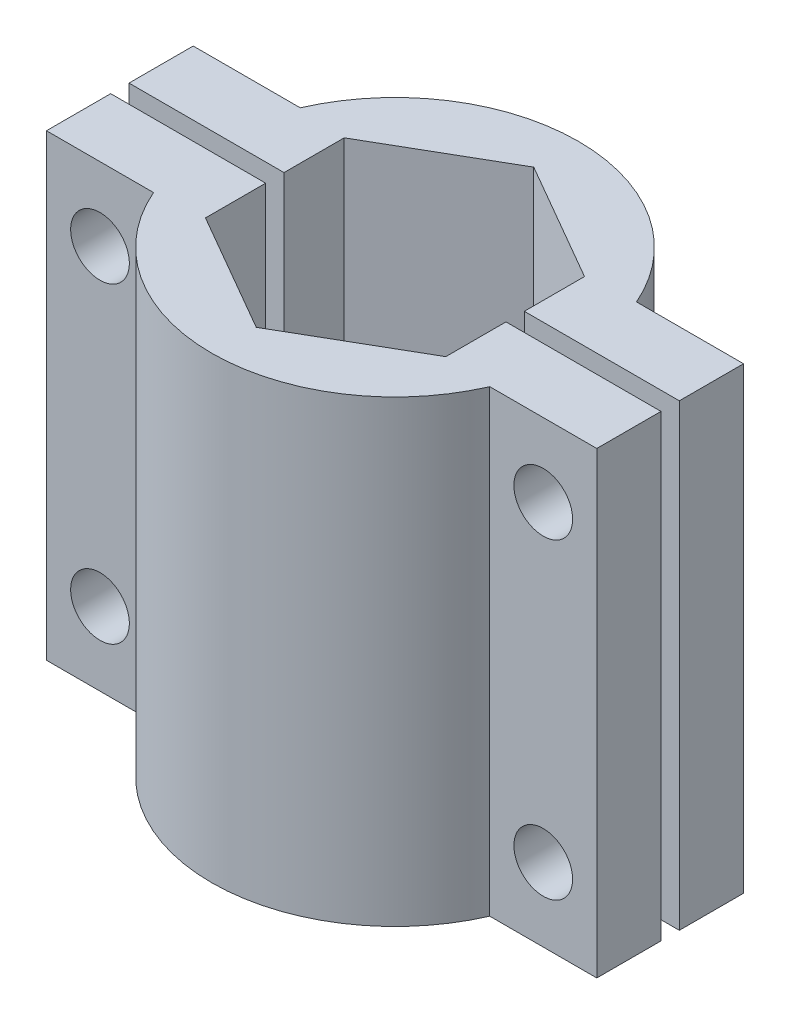
ISO-10303-21;
HEADER;
FILE_DESCRIPTION(('STEP AP214'),'2;1');
FILE_NAME('part.step','',(''),(''),'','','');
FILE_SCHEMA(('AUTOMOTIVE_DESIGN { 1 0 10303 214 1 1 1 1 }'));
ENDSEC;
DATA;
#1=APPLICATION_CONTEXT('core data for automotive mechanical design processes');
#2=APPLICATION_PROTOCOL_DEFINITION('international standard','automotive_design',2000,#1);
#3=PRODUCT_CONTEXT('',#1,'mechanical');
#4=PRODUCT('Part','Part','',(#3));
#5=PRODUCT_RELATED_PRODUCT_CATEGORY('part','',(#4));
#6=PRODUCT_DEFINITION_FORMATION('','',#4);
#7=PRODUCT_DEFINITION_CONTEXT('part definition',#1,'design');
#8=PRODUCT_DEFINITION('design','',#6,#7);
#9=PRODUCT_DEFINITION_SHAPE('','',#8);
#10=(LENGTH_UNIT() NAMED_UNIT(*) SI_UNIT(.MILLI.,.METRE.));
#11=(NAMED_UNIT(*) PLANE_ANGLE_UNIT() SI_UNIT($,.RADIAN.));
#12=(NAMED_UNIT(*) SI_UNIT($,.STERADIAN.) SOLID_ANGLE_UNIT());
#13=UNCERTAINTY_MEASURE_WITH_UNIT(LENGTH_MEASURE(1.E-05),#10,'distance_accuracy_value','');
#14=(GEOMETRIC_REPRESENTATION_CONTEXT(3) GLOBAL_UNCERTAINTY_ASSIGNED_CONTEXT((#13)) GLOBAL_UNIT_ASSIGNED_CONTEXT((#10,
#11,#12)) REPRESENTATION_CONTEXT('',''));
#15=CARTESIAN_POINT('',(0.,0.,0.));
#16=DIRECTION('',(0.,0.,1.));
#17=DIRECTION('',(1.,0.,0.));
#18=AXIS2_PLACEMENT_3D('',#15,#16,#17);
#19=CARTESIAN_POINT('',(15.,25.,4.));
#20=DIRECTION('',(-1.,0.,0.));
#21=DIRECTION('',(0.,0.,1.));
#22=AXIS2_PLACEMENT_3D('',#19,#20,#21);
#23=PLANE('',#22);
#24=DIRECTION('',(0.,-1.,0.));
#25=VECTOR('',#24,1.);
#26=CARTESIAN_POINT('',(15.,25.,-0.5));
#27=LINE('',#26,#25);
#28=CARTESIAN_POINT('',(15.,25.,-0.5));
#29=VERTEX_POINT('',#28);
#30=CARTESIAN_POINT('',(15.,0.,-0.5));
#31=VERTEX_POINT('',#30);
#32=EDGE_CURVE('E119',#29,#31,#27,.T.);
#33=ORIENTED_EDGE('',*,*,#32,.T.);
#34=DIRECTION('',(0.,0.,-1.));
#35=VECTOR('',#34,1.);
#36=CARTESIAN_POINT('',(15.,0.,4.));
#37=LINE('',#36,#35);
#38=CARTESIAN_POINT('',(15.,0.,-4.));
#39=VERTEX_POINT('',#38);
#40=EDGE_CURVE('E116',#31,#39,#37,.T.);
#41=ORIENTED_EDGE('',*,*,#40,.T.);
#42=DIRECTION('',(0.,-1.,0.));
#43=VECTOR('',#42,1.);
#44=CARTESIAN_POINT('',(15.,25.,-4.));
#45=LINE('',#44,#43);
#46=CARTESIAN_POINT('',(15.,25.,-4.));
#47=VERTEX_POINT('',#46);
#48=EDGE_CURVE('E170',#47,#39,#45,.T.);
#49=ORIENTED_EDGE('',*,*,#48,.F.);
#50=DIRECTION('',(0.,0.,-1.));
#51=VECTOR('',#50,1.);
#52=CARTESIAN_POINT('',(15.,25.,4.));
#53=LINE('',#52,#51);
#54=EDGE_CURVE('E107',#29,#47,#53,.T.);
#55=ORIENTED_EDGE('',*,*,#54,.F.);
#56=EDGE_LOOP('',(#33,#41,#49,#55));
#57=FACE_BOUND('',#56,.T.);
#58=ADVANCED_FACE('F44',(#57),#23,.F.);
#59=CARTESIAN_POINT('',(-15.,25.,4.));
#60=DIRECTION('',(1.,0.,0.));
#61=DIRECTION('',(0.,0.,-1.));
#62=AXIS2_PLACEMENT_3D('',#59,#60,#61);
#63=PLANE('',#62);
#64=DIRECTION('',(0.,-1.,0.));
#65=VECTOR('',#64,1.);
#66=CARTESIAN_POINT('',(-15.,25.,-0.5));
#67=LINE('',#66,#65);
#68=CARTESIAN_POINT('',(-15.,25.,-0.5));
#69=VERTEX_POINT('',#68);
#70=CARTESIAN_POINT('',(-15.,0.,-0.5));
#71=VERTEX_POINT('',#70);
#72=EDGE_CURVE('E12',#69,#71,#67,.T.);
#73=ORIENTED_EDGE('',*,*,#72,.F.);
#74=DIRECTION('',(0.,0.,1.));
#75=VECTOR('',#74,1.);
#76=CARTESIAN_POINT('',(-15.,25.,4.));
#77=LINE('',#76,#75);
#78=CARTESIAN_POINT('',(-15.,25.,-4.));
#79=VERTEX_POINT('',#78);
#80=EDGE_CURVE('E98',#79,#69,#77,.T.);
#81=ORIENTED_EDGE('',*,*,#80,.F.);
#82=DIRECTION('',(0.,-1.,0.));
#83=VECTOR('',#82,1.);
#84=CARTESIAN_POINT('',(-15.,25.,-4.));
#85=LINE('',#84,#83);
#86=CARTESIAN_POINT('',(-15.,0.,-4.));
#87=VERTEX_POINT('',#86);
#88=EDGE_CURVE('E112',#79,#87,#85,.T.);
#89=ORIENTED_EDGE('',*,*,#88,.T.);
#90=DIRECTION('',(0.,0.,1.));
#91=VECTOR('',#90,1.);
#92=CARTESIAN_POINT('',(-15.,0.,4.));
#93=LINE('',#92,#91);
#94=EDGE_CURVE('E100',#87,#71,#93,.T.);
#95=ORIENTED_EDGE('',*,*,#94,.T.);
#96=EDGE_LOOP('',(#73,#81,#89,#95));
#97=FACE_BOUND('',#96,.T.);
#98=ADVANCED_FACE('F95',(#97),#63,.F.);
#99=CARTESIAN_POINT('',(0.,25.,0.));
#100=DIRECTION('',(0.,1.,0.));
#101=DIRECTION('',(0.,0.,1.));
#102=AXIS2_PLACEMENT_3D('',#99,#100,#101);
#103=PLANE('',#102);
#104=ORIENTED_EDGE('',*,*,#80,.T.);
#105=DIRECTION('',(-1.,0.,0.));
#106=VECTOR('',#105,1.);
#107=CARTESIAN_POINT('',(-15.,25.,-0.5));
#108=LINE('',#107,#106);
#109=CARTESIAN_POINT('',(-6.55,25.,-0.5));
#110=VERTEX_POINT('',#109);
#111=EDGE_CURVE('E53',#110,#69,#108,.T.);
#112=ORIENTED_EDGE('',*,*,#111,.F.);
#113=DIRECTION('',(0.,0.,1.));
#114=VECTOR('',#113,1.);
#115=CARTESIAN_POINT('',(-6.55,25.,-3.78164426319205));
#116=LINE('',#115,#114);
#117=CARTESIAN_POINT('',(-6.55,25.,-3.78164426319205));
#118=VERTEX_POINT('',#117);
#119=EDGE_CURVE('E136',#118,#110,#116,.T.);
#120=ORIENTED_EDGE('',*,*,#119,.F.);
#121=DIRECTION('',(-0.866025403784439,0.,0.5));
#122=VECTOR('',#121,1.);
#123=CARTESIAN_POINT('',(0.,25.,-7.5632885263841));
#124=LINE('',#123,#122);
#125=CARTESIAN_POINT('',(0.,25.,-7.5632885263841));
#126=VERTEX_POINT('',#125);
#127=EDGE_CURVE('E181',#126,#118,#124,.T.);
#128=ORIENTED_EDGE('',*,*,#127,.F.);
#129=DIRECTION('',(-0.866025403784439,0.,-0.5));
#130=VECTOR('',#129,1.);
#131=CARTESIAN_POINT('',(6.55,25.,-3.78164426319205));
#132=LINE('',#131,#130);
#133=CARTESIAN_POINT('',(6.55,25.,-3.78164426319205));
#134=VERTEX_POINT('',#133);
#135=EDGE_CURVE('E198',#134,#126,#132,.T.);
#136=ORIENTED_EDGE('',*,*,#135,.F.);
#137=DIRECTION('',(0.,0.,-1.));
#138=VECTOR('',#137,1.);
#139=CARTESIAN_POINT('',(6.55,25.,3.78164426319205));
#140=LINE('',#139,#138);
#141=CARTESIAN_POINT('',(6.55,25.,-0.499999999999999));
#142=VERTEX_POINT('',#141);
#143=EDGE_CURVE('E138',#142,#134,#140,.T.);
#144=ORIENTED_EDGE('',*,*,#143,.F.);
#145=EDGE_CURVE('E91',#29,#142,#108,.T.);
#146=ORIENTED_EDGE('',*,*,#145,.F.);
#147=ORIENTED_EDGE('',*,*,#54,.T.);
#148=DIRECTION('',(-1.,0.,0.));
#149=VECTOR('',#148,1.);
#150=CARTESIAN_POINT('',(9.16515138991168,25.,-4.));
#151=LINE('',#150,#149);
#152=CARTESIAN_POINT('',(9.16515138991168,25.,-4.));
#153=VERTEX_POINT('',#152);
#154=EDGE_CURVE('E110',#47,#153,#151,.T.);
#155=ORIENTED_EDGE('',*,*,#154,.T.);
#156=CARTESIAN_POINT('',(0.,25.,0.));
#157=DIRECTION('',(0.,1.,0.));
#158=DIRECTION('',(0.,0.,1.));
#159=AXIS2_PLACEMENT_3D('',#156,#157,#158);
#160=CIRCLE('',#159,10.);
#161=CARTESIAN_POINT('',(-9.16515138991168,25.,-4.));
#162=VERTEX_POINT('',#161);
#163=EDGE_CURVE('E190',#153,#162,#160,.T.);
#164=ORIENTED_EDGE('',*,*,#163,.T.);
#165=DIRECTION('',(-1.,0.,0.));
#166=VECTOR('',#165,1.);
#167=CARTESIAN_POINT('',(-15.,25.,-4.));
#168=LINE('',#167,#166);
#169=EDGE_CURVE('E105',#162,#79,#168,.T.);
#170=ORIENTED_EDGE('',*,*,#169,.T.);
#171=EDGE_LOOP('',(#104,#112,#120,#128,#136,#144,#146,#147,#155,#164,#170));
#172=FACE_BOUND('',#171,.T.);
#173=ADVANCED_FACE('F102',(#172),#103,.T.);
#174=CARTESIAN_POINT('',(0.,0.,0.));
#175=DIRECTION('',(0.,1.,0.));
#176=DIRECTION('',(0.,0.,1.));
#177=AXIS2_PLACEMENT_3D('',#174,#175,#176);
#178=PLANE('',#177);
#179=DIRECTION('',(-1.,0.,0.));
#180=VECTOR('',#179,1.);
#181=CARTESIAN_POINT('',(-15.,0.,-0.5));
#182=LINE('',#181,#180);
#183=CARTESIAN_POINT('',(-3.00873727666608,0.,-0.5));
#184=VERTEX_POINT('',#183);
#185=EDGE_CURVE('E61',#184,#71,#182,.T.);
#186=ORIENTED_EDGE('',*,*,#185,.T.);
#187=ORIENTED_EDGE('',*,*,#94,.F.);
#188=DIRECTION('',(-1.,0.,0.));
#189=VECTOR('',#188,1.);
#190=CARTESIAN_POINT('',(-15.,0.,-4.));
#191=LINE('',#190,#189);
#192=CARTESIAN_POINT('',(-9.16515138991168,0.,-4.));
#193=VERTEX_POINT('',#192);
#194=EDGE_CURVE('E177',#193,#87,#191,.T.);
#195=ORIENTED_EDGE('',*,*,#194,.F.);
#196=CARTESIAN_POINT('',(0.,0.,0.));
#197=DIRECTION('',(0.,1.,0.));
#198=DIRECTION('',(0.,0.,1.));
#199=AXIS2_PLACEMENT_3D('',#196,#197,#198);
#200=CIRCLE('',#199,10.);
#201=CARTESIAN_POINT('',(9.16515138991168,0.,-4.));
#202=VERTEX_POINT('',#201);
#203=EDGE_CURVE('E173',#202,#193,#200,.T.);
#204=ORIENTED_EDGE('',*,*,#203,.F.);
#205=DIRECTION('',(-1.,0.,0.));
#206=VECTOR('',#205,1.);
#207=CARTESIAN_POINT('',(9.16515138991168,0.,-4.));
#208=LINE('',#207,#206);
#209=EDGE_CURVE('E142',#39,#202,#208,.T.);
#210=ORIENTED_EDGE('',*,*,#209,.F.);
#211=ORIENTED_EDGE('',*,*,#40,.F.);
#212=CARTESIAN_POINT('',(3.00873727666608,0.,-0.5));
#213=VERTEX_POINT('',#212);
#214=EDGE_CURVE('E129',#31,#213,#182,.T.);
#215=ORIENTED_EDGE('',*,*,#214,.T.);
#216=CARTESIAN_POINT('',(0.,0.,0.));
#217=DIRECTION('',(0.,-1.,0.));
#218=DIRECTION('',(0.,0.,-1.));
#219=AXIS2_PLACEMENT_3D('',#216,#217,#218);
#220=CIRCLE('',#219,3.05);
#221=EDGE_CURVE('E125',#184,#213,#220,.T.);
#222=ORIENTED_EDGE('',*,*,#221,.F.);
#223=EDGE_LOOP('',(#186,#187,#195,#204,#210,#211,#215,#222));
#224=FACE_BOUND('',#223,.T.);
#225=ADVANCED_FACE('F223',(#224),#178,.F.);
#226=CARTESIAN_POINT('',(0.,12.5,0.));
#227=DIRECTION('',(0.,-1.,0.));
#228=DIRECTION('',(0.,0.,-1.));
#229=AXIS2_PLACEMENT_3D('',#226,#227,#228);
#230=CYLINDRICAL_SURFACE('',#229,3.05);
#231=DIRECTION('',(0.,-1.,0.));
#232=VECTOR('',#231,1.);
#233=CARTESIAN_POINT('',(-3.00873727666608,12.5,-0.5));
#234=LINE('',#233,#232);
#235=CARTESIAN_POINT('',(-3.00873727666608,12.5,-0.5));
#236=VERTEX_POINT('',#235);
#237=EDGE_CURVE('E169',#184,#236,#234,.F.);
#238=ORIENTED_EDGE('',*,*,#237,.F.);
#239=ORIENTED_EDGE('',*,*,#221,.T.);
#240=DIRECTION('',(0.,-1.,0.));
#241=VECTOR('',#240,1.);
#242=CARTESIAN_POINT('',(3.00873727666608,12.5,-0.5));
#243=LINE('',#242,#241);
#244=CARTESIAN_POINT('',(3.00873727666608,12.5,-0.5));
#245=VERTEX_POINT('',#244);
#246=EDGE_CURVE('E197',#245,#213,#243,.T.);
#247=ORIENTED_EDGE('',*,*,#246,.F.);
#248=CARTESIAN_POINT('',(0.,12.5,0.));
#249=DIRECTION('',(0.,-1.,0.));
#250=DIRECTION('',(0.,0.,-1.));
#251=AXIS2_PLACEMENT_3D('',#248,#249,#250);
#252=CIRCLE('',#251,3.05);
#253=EDGE_CURVE('E120',#236,#245,#252,.T.);
#254=ORIENTED_EDGE('',*,*,#253,.F.);
#255=EDGE_LOOP('',(#238,#239,#247,#254));
#256=FACE_BOUND('',#255,.T.);
#257=ADVANCED_FACE('F228',(#256),#230,.F.);
#258=CARTESIAN_POINT('',(0.,12.5,0.));
#259=DIRECTION('',(0.,1.,0.));
#260=DIRECTION('',(0.,0.,1.));
#261=AXIS2_PLACEMENT_3D('',#258,#259,#260);
#262=PLANE('',#261);
#263=DIRECTION('',(0.,0.,1.));
#264=VECTOR('',#263,1.);
#265=CARTESIAN_POINT('',(-6.55,12.5,-3.78164426319205));
#266=LINE('',#265,#264);
#267=CARTESIAN_POINT('',(-6.55,12.5,-3.78164426319205));
#268=VERTEX_POINT('',#267);
#269=CARTESIAN_POINT('',(-6.55,12.5,-0.500000000000001));
#270=VERTEX_POINT('',#269);
#271=EDGE_CURVE('E128',#268,#270,#266,.T.);
#272=ORIENTED_EDGE('',*,*,#271,.T.);
#273=DIRECTION('',(1.,0.,0.));
#274=VECTOR('',#273,1.);
#275=CARTESIAN_POINT('',(0.,12.5,-0.5));
#276=LINE('',#275,#274);
#277=EDGE_CURVE('E124',#270,#236,#276,.T.);
#278=ORIENTED_EDGE('',*,*,#277,.T.);
#279=ORIENTED_EDGE('',*,*,#253,.T.);
#280=CARTESIAN_POINT('',(6.55,12.5,-0.5));
#281=VERTEX_POINT('',#280);
#282=EDGE_CURVE('E123',#245,#281,#276,.T.);
#283=ORIENTED_EDGE('',*,*,#282,.T.);
#284=DIRECTION('',(0.,0.,-1.));
#285=VECTOR('',#284,1.);
#286=CARTESIAN_POINT('',(6.55,12.5,3.78164426319205));
#287=LINE('',#286,#285);
#288=CARTESIAN_POINT('',(6.55,12.5,-3.78164426319205));
#289=VERTEX_POINT('',#288);
#290=EDGE_CURVE('E132',#281,#289,#287,.T.);
#291=ORIENTED_EDGE('',*,*,#290,.T.);
#292=DIRECTION('',(-0.866025403784439,0.,-0.5));
#293=VECTOR('',#292,1.);
#294=CARTESIAN_POINT('',(6.55,12.5,-3.78164426319205));
#295=LINE('',#294,#293);
#296=CARTESIAN_POINT('',(0.,12.5,-7.5632885263841));
#297=VERTEX_POINT('',#296);
#298=EDGE_CURVE('E135',#289,#297,#295,.T.);
#299=ORIENTED_EDGE('',*,*,#298,.T.);
#300=DIRECTION('',(-0.866025403784439,0.,0.5));
#301=VECTOR('',#300,1.);
#302=CARTESIAN_POINT('',(0.,12.5,-7.5632885263841));
#303=LINE('',#302,#301);
#304=EDGE_CURVE('E204',#297,#268,#303,.T.);
#305=ORIENTED_EDGE('',*,*,#304,.T.);
#306=EDGE_LOOP('',(#272,#278,#279,#283,#291,#299,#305));
#307=FACE_BOUND('',#306,.T.);
#308=ADVANCED_FACE('F235',(#307),#262,.T.);
#309=CARTESIAN_POINT('',(-6.55,12.5,-3.78164426319205));
#310=DIRECTION('',(-1.,0.,0.));
#311=DIRECTION('',(0.,0.,1.));
#312=AXIS2_PLACEMENT_3D('',#309,#310,#311);
#313=PLANE('',#312);
#314=DIRECTION('',(0.,1.,0.));
#315=VECTOR('',#314,1.);
#316=CARTESIAN_POINT('',(-6.55,12.5,-0.5));
#317=LINE('',#316,#315);
#318=EDGE_CURVE('E85',#270,#110,#317,.T.);
#319=ORIENTED_EDGE('',*,*,#318,.F.);
#320=ORIENTED_EDGE('',*,*,#271,.F.);
#321=DIRECTION('',(0.,1.,0.));
#322=VECTOR('',#321,1.);
#323=CARTESIAN_POINT('',(-6.55,12.5,-3.78164426319205));
#324=LINE('',#323,#322);
#325=EDGE_CURVE('E139',#268,#118,#324,.T.);
#326=ORIENTED_EDGE('',*,*,#325,.T.);
#327=ORIENTED_EDGE('',*,*,#119,.T.);
#328=EDGE_LOOP('',(#319,#320,#326,#327));
#329=FACE_BOUND('',#328,.T.);
#330=ADVANCED_FACE('F241',(#329),#313,.F.);
#331=CARTESIAN_POINT('',(6.55,12.5,3.78164426319205));
#332=DIRECTION('',(1.,0.,0.));
#333=DIRECTION('',(0.,0.,-1.));
#334=AXIS2_PLACEMENT_3D('',#331,#332,#333);
#335=PLANE('',#334);
#336=DIRECTION('',(0.,-1.,0.));
#337=VECTOR('',#336,1.);
#338=CARTESIAN_POINT('',(6.55,12.5,-0.5));
#339=LINE('',#338,#337);
#340=EDGE_CURVE('E166',#142,#281,#339,.T.);
#341=ORIENTED_EDGE('',*,*,#340,.F.);
#342=ORIENTED_EDGE('',*,*,#143,.T.);
#343=DIRECTION('',(0.,1.,0.));
#344=VECTOR('',#343,1.);
#345=CARTESIAN_POINT('',(6.55,12.5,-3.78164426319205));
#346=LINE('',#345,#344);
#347=EDGE_CURVE('E194',#289,#134,#346,.T.);
#348=ORIENTED_EDGE('',*,*,#347,.F.);
#349=ORIENTED_EDGE('',*,*,#290,.F.);
#350=EDGE_LOOP('',(#341,#342,#348,#349));
#351=FACE_BOUND('',#350,.T.);
#352=ADVANCED_FACE('F280',(#351),#335,.F.);
#353=CARTESIAN_POINT('',(9.16515138991168,25.,-4.));
#354=DIRECTION('',(0.,0.,1.));
#355=DIRECTION('',(1.,0.,0.));
#356=AXIS2_PLACEMENT_3D('',#353,#354,#355);
#357=PLANE('',#356);
#358=CARTESIAN_POINT('',(12.0825756949558,21.,-4.));
#359=DIRECTION('',(0.,0.,1.));
#360=DIRECTION('',(1.,0.,0.));
#361=AXIS2_PLACEMENT_3D('',#358,#359,#360);
#362=CIRCLE('',#361,1.6);
#363=CARTESIAN_POINT('',(13.6825756949558,21.,-4.));
#364=VERTEX_POINT('',#363);
#365=EDGE_CURVE('E163',#364,#364,#362,.T.);
#366=ORIENTED_EDGE('',*,*,#365,.T.);
#367=EDGE_LOOP('',(#366));
#368=FACE_BOUND('',#367,.T.);
#369=CARTESIAN_POINT('',(12.0825756949558,4.,-4.));
#370=DIRECTION('',(0.,0.,1.));
#371=DIRECTION('',(1.,0.,0.));
#372=AXIS2_PLACEMENT_3D('',#369,#370,#371);
#373=CIRCLE('',#372,1.6);
#374=CARTESIAN_POINT('',(13.6825756949558,4.,-4.));
#375=VERTEX_POINT('',#374);
#376=EDGE_CURVE('E152',#375,#375,#373,.T.);
#377=ORIENTED_EDGE('',*,*,#376,.T.);
#378=EDGE_LOOP('',(#377));
#379=FACE_BOUND('',#378,.T.);
#380=ORIENTED_EDGE('',*,*,#209,.T.);
#381=DIRECTION('',(0.,-1.,0.));
#382=VECTOR('',#381,1.);
#383=CARTESIAN_POINT('',(9.16515138991168,25.,-4.));
#384=LINE('',#383,#382);
#385=EDGE_CURVE('E174',#153,#202,#384,.T.);
#386=ORIENTED_EDGE('',*,*,#385,.F.);
#387=ORIENTED_EDGE('',*,*,#154,.F.);
#388=ORIENTED_EDGE('',*,*,#48,.T.);
#389=EDGE_LOOP('',(#380,#386,#387,#388));
#390=FACE_BOUND('',#389,.T.);
#391=ADVANCED_FACE('F312',(#368,#379,#390),#357,.F.);
#392=CARTESIAN_POINT('',(0.,25.,0.));
#393=DIRECTION('',(0.,-1.,0.));
#394=DIRECTION('',(0.,0.,-1.));
#395=AXIS2_PLACEMENT_3D('',#392,#393,#394);
#396=CYLINDRICAL_SURFACE('',#395,10.);
#397=ORIENTED_EDGE('',*,*,#203,.T.);
#398=DIRECTION('',(0.,-1.,0.));
#399=VECTOR('',#398,1.);
#400=CARTESIAN_POINT('',(-9.16515138991168,25.,-4.));
#401=LINE('',#400,#399);
#402=EDGE_CURVE('E178',#162,#193,#401,.T.);
#403=ORIENTED_EDGE('',*,*,#402,.F.);
#404=ORIENTED_EDGE('',*,*,#163,.F.);
#405=ORIENTED_EDGE('',*,*,#385,.T.);
#406=EDGE_LOOP('',(#397,#403,#404,#405));
#407=FACE_BOUND('',#406,.T.);
#408=ADVANCED_FACE('F297',(#407),#396,.T.);
#409=CARTESIAN_POINT('',(-15.,25.,-4.));
#410=DIRECTION('',(0.,0.,1.));
#411=DIRECTION('',(1.,0.,0.));
#412=AXIS2_PLACEMENT_3D('',#409,#410,#411);
#413=PLANE('',#412);
#414=CARTESIAN_POINT('',(-12.0825756949558,21.,-4.));
#415=DIRECTION('',(0.,0.,1.));
#416=DIRECTION('',(1.,0.,0.));
#417=AXIS2_PLACEMENT_3D('',#414,#415,#416);
#418=CIRCLE('',#417,1.6);
#419=CARTESIAN_POINT('',(-10.4825756949558,21.,-4.));
#420=VERTEX_POINT('',#419);
#421=EDGE_CURVE('E149',#420,#420,#418,.T.);
#422=ORIENTED_EDGE('',*,*,#421,.T.);
#423=EDGE_LOOP('',(#422));
#424=FACE_BOUND('',#423,.T.);
#425=CARTESIAN_POINT('',(-12.0825756949558,4.,-4.));
#426=DIRECTION('',(0.,0.,1.));
#427=DIRECTION('',(1.,0.,0.));
#428=AXIS2_PLACEMENT_3D('',#425,#426,#427);
#429=CIRCLE('',#428,1.6);
#430=CARTESIAN_POINT('',(-10.4825756949558,4.,-4.));
#431=VERTEX_POINT('',#430);
#432=EDGE_CURVE('E146',#431,#431,#429,.T.);
#433=ORIENTED_EDGE('',*,*,#432,.T.);
#434=EDGE_LOOP('',(#433));
#435=FACE_BOUND('',#434,.T.);
#436=ORIENTED_EDGE('',*,*,#194,.T.);
#437=ORIENTED_EDGE('',*,*,#88,.F.);
#438=ORIENTED_EDGE('',*,*,#169,.F.);
#439=ORIENTED_EDGE('',*,*,#402,.T.);
#440=EDGE_LOOP('',(#436,#437,#438,#439));
#441=FACE_BOUND('',#440,.T.);
#442=ADVANCED_FACE('F289',(#424,#435,#441),#413,.F.);
#443=CARTESIAN_POINT('',(0.,12.5,-7.5632885263841));
#444=DIRECTION('',(-0.5,0.,-0.866025403784439));
#445=DIRECTION('',(-0.866025403784439,0.,0.5));
#446=AXIS2_PLACEMENT_3D('',#443,#444,#445);
#447=PLANE('',#446);
#448=ORIENTED_EDGE('',*,*,#127,.T.);
#449=ORIENTED_EDGE('',*,*,#325,.F.);
#450=ORIENTED_EDGE('',*,*,#304,.F.);
#451=DIRECTION('',(0.,1.,0.));
#452=VECTOR('',#451,1.);
#453=CARTESIAN_POINT('',(0.,12.5,-7.5632885263841));
#454=LINE('',#453,#452);
#455=EDGE_CURVE('E199',#297,#126,#454,.T.);
#456=ORIENTED_EDGE('',*,*,#455,.T.);
#457=EDGE_LOOP('',(#448,#449,#450,#456));
#458=FACE_BOUND('',#457,.T.);
#459=ADVANCED_FACE('F287',(#458),#447,.F.);
#460=CARTESIAN_POINT('',(6.55,12.5,-3.78164426319205));
#461=DIRECTION('',(0.5,0.,-0.866025403784439));
#462=DIRECTION('',(-0.866025403784439,0.,-0.5));
#463=AXIS2_PLACEMENT_3D('',#460,#461,#462);
#464=PLANE('',#463);
#465=ORIENTED_EDGE('',*,*,#135,.T.);
#466=ORIENTED_EDGE('',*,*,#455,.F.);
#467=ORIENTED_EDGE('',*,*,#298,.F.);
#468=ORIENTED_EDGE('',*,*,#347,.T.);
#469=EDGE_LOOP('',(#465,#466,#467,#468));
#470=FACE_BOUND('',#469,.T.);
#471=ADVANCED_FACE('F285',(#470),#464,.F.);
#472=CARTESIAN_POINT('',(-15.,25.,-0.5));
#473=DIRECTION('',(0.,0.,1.));
#474=DIRECTION('',(1.,0.,0.));
#475=AXIS2_PLACEMENT_3D('',#472,#473,#474);
#476=PLANE('',#475);
#477=CARTESIAN_POINT('',(12.0825756949558,21.,-0.5));
#478=DIRECTION('',(0.,0.,1.));
#479=DIRECTION('',(1.,0.,0.));
#480=AXIS2_PLACEMENT_3D('',#477,#478,#479);
#481=CIRCLE('',#480,1.6);
#482=CARTESIAN_POINT('',(13.6825756949558,21.,-0.5));
#483=VERTEX_POINT('',#482);
#484=EDGE_CURVE('E47',#483,#483,#481,.T.);
#485=ORIENTED_EDGE('',*,*,#484,.F.);
#486=EDGE_LOOP('',(#485));
#487=FACE_BOUND('',#486,.T.);
#488=CARTESIAN_POINT('',(12.0825756949558,4.,-0.5));
#489=DIRECTION('',(0.,0.,1.));
#490=DIRECTION('',(1.,0.,0.));
#491=AXIS2_PLACEMENT_3D('',#488,#489,#490);
#492=CIRCLE('',#491,1.6);
#493=CARTESIAN_POINT('',(13.6825756949558,4.,-0.5));
#494=VERTEX_POINT('',#493);
#495=EDGE_CURVE('E150',#494,#494,#492,.T.);
#496=ORIENTED_EDGE('',*,*,#495,.F.);
#497=EDGE_LOOP('',(#496));
#498=FACE_BOUND('',#497,.T.);
#499=ORIENTED_EDGE('',*,*,#246,.T.);
#500=ORIENTED_EDGE('',*,*,#214,.F.);
#501=ORIENTED_EDGE('',*,*,#32,.F.);
#502=ORIENTED_EDGE('',*,*,#145,.T.);
#503=ORIENTED_EDGE('',*,*,#340,.T.);
#504=ORIENTED_EDGE('',*,*,#282,.F.);
#505=EDGE_LOOP('',(#499,#500,#501,#502,#503,#504));
#506=FACE_BOUND('',#505,.T.);
#507=ADVANCED_FACE('F295',(#487,#498,#506),#476,.T.);
#508=CARTESIAN_POINT('',(-12.0825756949558,21.,-0.5));
#509=DIRECTION('',(0.,0.,1.));
#510=DIRECTION('',(1.,0.,0.));
#511=AXIS2_PLACEMENT_3D('',#508,#509,#510);
#512=CIRCLE('',#511,1.6);
#513=CARTESIAN_POINT('',(-10.4825756949558,21.,-0.5));
#514=VERTEX_POINT('',#513);
#515=EDGE_CURVE('E147',#514,#514,#512,.T.);
#516=ORIENTED_EDGE('',*,*,#515,.F.);
#517=EDGE_LOOP('',(#516));
#518=FACE_BOUND('',#517,.T.);
#519=CARTESIAN_POINT('',(-12.0825756949558,4.,-0.5));
#520=DIRECTION('',(0.,0.,1.));
#521=DIRECTION('',(1.,0.,0.));
#522=AXIS2_PLACEMENT_3D('',#519,#520,#521);
#523=CIRCLE('',#522,1.6);
#524=CARTESIAN_POINT('',(-10.4825756949558,4.,-0.5));
#525=VERTEX_POINT('',#524);
#526=EDGE_CURVE('E143',#525,#525,#523,.T.);
#527=ORIENTED_EDGE('',*,*,#526,.F.);
#528=EDGE_LOOP('',(#527));
#529=FACE_BOUND('',#528,.T.);
#530=ORIENTED_EDGE('',*,*,#237,.T.);
#531=ORIENTED_EDGE('',*,*,#277,.F.);
#532=ORIENTED_EDGE('',*,*,#318,.T.);
#533=ORIENTED_EDGE('',*,*,#111,.T.);
#534=ORIENTED_EDGE('',*,*,#72,.T.);
#535=ORIENTED_EDGE('',*,*,#185,.F.);
#536=EDGE_LOOP('',(#530,#531,#532,#533,#534,#535));
#537=FACE_BOUND('',#536,.T.);
#538=ADVANCED_FACE('F82',(#518,#529,#537),#476,.T.);
#539=CARTESIAN_POINT('',(-12.0825756949558,4.,-10.));
#540=DIRECTION('',(0.,0.,1.));
#541=DIRECTION('',(1.,0.,0.));
#542=AXIS2_PLACEMENT_3D('',#539,#540,#541);
#543=CYLINDRICAL_SURFACE('',#542,1.6);
#544=ORIENTED_EDGE('',*,*,#526,.T.);
#545=EDGE_LOOP('',(#544));
#546=FACE_BOUND('',#545,.T.);
#547=ORIENTED_EDGE('',*,*,#432,.F.);
#548=EDGE_LOOP('',(#547));
#549=FACE_BOUND('',#548,.T.);
#550=ADVANCED_FACE('F330',(#546,#549),#543,.F.);
#551=CARTESIAN_POINT('',(-12.0825756949558,21.,-10.));
#552=DIRECTION('',(0.,0.,1.));
#553=DIRECTION('',(1.,0.,0.));
#554=AXIS2_PLACEMENT_3D('',#551,#552,#553);
#555=CYLINDRICAL_SURFACE('',#554,1.6);
#556=ORIENTED_EDGE('',*,*,#515,.T.);
#557=EDGE_LOOP('',(#556));
#558=FACE_BOUND('',#557,.T.);
#559=ORIENTED_EDGE('',*,*,#421,.F.);
#560=EDGE_LOOP('',(#559));
#561=FACE_BOUND('',#560,.T.);
#562=ADVANCED_FACE('F329',(#558,#561),#555,.F.);
#563=CARTESIAN_POINT('',(12.0825756949558,4.,-10.));
#564=DIRECTION('',(0.,0.,1.));
#565=DIRECTION('',(1.,0.,0.));
#566=AXIS2_PLACEMENT_3D('',#563,#564,#565);
#567=CYLINDRICAL_SURFACE('',#566,1.6);
#568=ORIENTED_EDGE('',*,*,#495,.T.);
#569=EDGE_LOOP('',(#568));
#570=FACE_BOUND('',#569,.T.);
#571=ORIENTED_EDGE('',*,*,#376,.F.);
#572=EDGE_LOOP('',(#571));
#573=FACE_BOUND('',#572,.T.);
#574=ADVANCED_FACE('F325',(#570,#573),#567,.F.);
#575=CARTESIAN_POINT('',(12.0825756949558,21.,-10.));
#576=DIRECTION('',(0.,0.,1.));
#577=DIRECTION('',(1.,0.,0.));
#578=AXIS2_PLACEMENT_3D('',#575,#576,#577);
#579=CYLINDRICAL_SURFACE('',#578,1.6);
#580=ORIENTED_EDGE('',*,*,#484,.T.);
#581=EDGE_LOOP('',(#580));
#582=FACE_BOUND('',#581,.T.);
#583=ORIENTED_EDGE('',*,*,#365,.F.);
#584=EDGE_LOOP('',(#583));
#585=FACE_BOUND('',#584,.T.);
#586=ADVANCED_FACE('F328',(#582,#585),#579,.F.);
#587=CLOSED_SHELL('',(#58,#98,#173,#225,#257,#308,#330,#352,#391,#408,#442,#459,#471,#507,#538,
#550,#562,#574,#586));
#588=MANIFOLD_SOLID_BREP('B2',#587);
#589=CARTESIAN_POINT('',(-15.,25.,4.));
#590=DIRECTION('',(0.,0.,-1.));
#591=DIRECTION('',(-1.,0.,0.));
#592=AXIS2_PLACEMENT_3D('',#589,#590,#591);
#593=PLANE('',#592);
#594=CARTESIAN_POINT('',(-12.0825756949558,21.,4.));
#595=DIRECTION('',(0.,0.,-1.));
#596=DIRECTION('',(-1.,0.,0.));
#597=AXIS2_PLACEMENT_3D('',#594,#595,#596);
#598=CIRCLE('',#597,1.6);
#599=CARTESIAN_POINT('',(-13.6825756949558,21.,4.));
#600=VERTEX_POINT('',#599);
#601=EDGE_CURVE('E648',#600,#600,#598,.T.);
#602=ORIENTED_EDGE('',*,*,#601,.T.);
#603=EDGE_LOOP('',(#602));
#604=FACE_BOUND('',#603,.T.);
#605=CARTESIAN_POINT('',(-12.0825756949558,4.,4.));
#606=DIRECTION('',(0.,0.,-1.));
#607=DIRECTION('',(-1.,0.,0.));
#608=AXIS2_PLACEMENT_3D('',#605,#606,#607);
#609=CIRCLE('',#608,1.6);
#610=CARTESIAN_POINT('',(-13.6825756949558,4.,4.));
#611=VERTEX_POINT('',#610);
#612=EDGE_CURVE('E645',#611,#611,#609,.T.);
#613=ORIENTED_EDGE('',*,*,#612,.T.);
#614=EDGE_LOOP('',(#613));
#615=FACE_BOUND('',#614,.T.);
#616=DIRECTION('',(1.,0.,0.));
#617=VECTOR('',#616,1.);
#618=CARTESIAN_POINT('',(-15.,0.,4.));
#619=LINE('',#618,#617);
#620=CARTESIAN_POINT('',(-15.,0.,4.));
#621=VERTEX_POINT('',#620);
#622=CARTESIAN_POINT('',(-9.16515138991168,0.,4.));
#623=VERTEX_POINT('',#622);
#624=EDGE_CURVE('E628',#621,#623,#619,.T.);
#625=ORIENTED_EDGE('',*,*,#624,.T.);
#626=DIRECTION('',(0.,-1.,0.));
#627=VECTOR('',#626,1.);
#628=CARTESIAN_POINT('',(-9.16515138991168,25.,4.));
#629=LINE('',#628,#627);
#630=CARTESIAN_POINT('',(-9.16515138991168,25.,4.));
#631=VERTEX_POINT('',#630);
#632=EDGE_CURVE('E638',#631,#623,#629,.T.);
#633=ORIENTED_EDGE('',*,*,#632,.F.);
#634=DIRECTION('',(1.,0.,0.));
#635=VECTOR('',#634,1.);
#636=CARTESIAN_POINT('',(-15.,25.,4.));
#637=LINE('',#636,#635);
#638=CARTESIAN_POINT('',(-15.,25.,4.));
#639=VERTEX_POINT('',#638);
#640=EDGE_CURVE('E609',#639,#631,#637,.T.);
#641=ORIENTED_EDGE('',*,*,#640,.F.);
#642=DIRECTION('',(0.,-1.,0.));
#643=VECTOR('',#642,1.);
#644=CARTESIAN_POINT('',(-15.,25.,4.));
#645=LINE('',#644,#643);
#646=EDGE_CURVE('E490',#639,#621,#645,.T.);
#647=ORIENTED_EDGE('',*,*,#646,.T.);
#648=EDGE_LOOP('',(#625,#633,#641,#647));
#649=FACE_BOUND('',#648,.T.);
#650=ADVANCED_FACE('F481',(#604,#615,#649),#593,.F.);
#651=CARTESIAN_POINT('',(0.,25.,0.));
#652=DIRECTION('',(0.,-1.,0.));
#653=DIRECTION('',(0.,0.,-1.));
#654=AXIS2_PLACEMENT_3D('',#651,#652,#653);
#655=CYLINDRICAL_SURFACE('',#654,10.);
#656=CARTESIAN_POINT('',(0.,0.,0.));
#657=DIRECTION('',(0.,1.,0.));
#658=DIRECTION('',(0.,0.,1.));
#659=AXIS2_PLACEMENT_3D('',#656,#657,#658);
#660=CIRCLE('',#659,10.);
#661=CARTESIAN_POINT('',(9.16515138991168,0.,4.));
#662=VERTEX_POINT('',#661);
#663=EDGE_CURVE('E630',#623,#662,#660,.T.);
#664=ORIENTED_EDGE('',*,*,#663,.T.);
#665=DIRECTION('',(0.,-1.,0.));
#666=VECTOR('',#665,1.);
#667=CARTESIAN_POINT('',(9.16515138991168,25.,4.));
#668=LINE('',#667,#666);
#669=CARTESIAN_POINT('',(9.16515138991168,25.,4.));
#670=VERTEX_POINT('',#669);
#671=EDGE_CURVE('E635',#670,#662,#668,.T.);
#672=ORIENTED_EDGE('',*,*,#671,.F.);
#673=CARTESIAN_POINT('',(0.,25.,0.));
#674=DIRECTION('',(0.,1.,0.));
#675=DIRECTION('',(0.,0.,1.));
#676=AXIS2_PLACEMENT_3D('',#673,#674,#675);
#677=CIRCLE('',#676,10.);
#678=EDGE_CURVE('E612',#631,#670,#677,.T.);
#679=ORIENTED_EDGE('',*,*,#678,.F.);
#680=ORIENTED_EDGE('',*,*,#632,.T.);
#681=EDGE_LOOP('',(#664,#672,#679,#680));
#682=FACE_BOUND('',#681,.T.);
#683=ADVANCED_FACE('F756',(#682),#655,.T.);
#684=CARTESIAN_POINT('',(9.16515138991168,25.,4.));
#685=DIRECTION('',(0.,0.,-1.));
#686=DIRECTION('',(-1.,0.,0.));
#687=AXIS2_PLACEMENT_3D('',#684,#685,#686);
#688=PLANE('',#687);
#689=CARTESIAN_POINT('',(12.0825756949558,21.,4.));
#690=DIRECTION('',(0.,0.,-1.));
#691=DIRECTION('',(-1.,0.,0.));
#692=AXIS2_PLACEMENT_3D('',#689,#690,#691);
#693=CIRCLE('',#692,1.6);
#694=CARTESIAN_POINT('',(10.4825756949558,21.,4.));
#695=VERTEX_POINT('',#694);
#696=EDGE_CURVE('E662',#695,#695,#693,.T.);
#697=ORIENTED_EDGE('',*,*,#696,.T.);
#698=EDGE_LOOP('',(#697));
#699=FACE_BOUND('',#698,.T.);
#700=CARTESIAN_POINT('',(12.0825756949558,4.,4.));
#701=DIRECTION('',(0.,0.,-1.));
#702=DIRECTION('',(-1.,0.,0.));
#703=AXIS2_PLACEMENT_3D('',#700,#701,#702);
#704=CIRCLE('',#703,1.6);
#705=CARTESIAN_POINT('',(10.4825756949558,4.,4.));
#706=VERTEX_POINT('',#705);
#707=EDGE_CURVE('E651',#706,#706,#704,.T.);
#708=ORIENTED_EDGE('',*,*,#707,.T.);
#709=EDGE_LOOP('',(#708));
#710=FACE_BOUND('',#709,.T.);
#711=DIRECTION('',(1.,0.,0.));
#712=VECTOR('',#711,1.);
#713=CARTESIAN_POINT('',(9.16515138991168,0.,4.));
#714=LINE('',#713,#712);
#715=CARTESIAN_POINT('',(15.,0.,4.));
#716=VERTEX_POINT('',#715);
#717=EDGE_CURVE('E614',#662,#716,#714,.T.);
#718=ORIENTED_EDGE('',*,*,#717,.T.);
#719=DIRECTION('',(0.,-1.,0.));
#720=VECTOR('',#719,1.);
#721=CARTESIAN_POINT('',(15.,25.,4.));
#722=LINE('',#721,#720);
#723=CARTESIAN_POINT('',(15.,25.,4.));
#724=VERTEX_POINT('',#723);
#725=EDGE_CURVE('E621',#724,#716,#722,.T.);
#726=ORIENTED_EDGE('',*,*,#725,.F.);
#727=DIRECTION('',(1.,0.,0.));
#728=VECTOR('',#727,1.);
#729=CARTESIAN_POINT('',(9.16515138991168,25.,4.));
#730=LINE('',#729,#728);
#731=EDGE_CURVE('E619',#670,#724,#730,.T.);
#732=ORIENTED_EDGE('',*,*,#731,.F.);
#733=ORIENTED_EDGE('',*,*,#671,.T.);
#734=EDGE_LOOP('',(#718,#726,#732,#733));
#735=FACE_BOUND('',#734,.T.);
#736=ADVANCED_FACE('F751',(#699,#710,#735),#688,.F.);
#737=CARTESIAN_POINT('',(1.74714052096561,12.5,2.5));
#738=DIRECTION('',(0.,0.,1.));
#739=DIRECTION('',(1.,0.,0.));
#740=AXIS2_PLACEMENT_3D('',#737,#738,#739);
#741=PLANE('',#740);
#742=DIRECTION('',(-1.,0.,0.));
#743=VECTOR('',#742,1.);
#744=CARTESIAN_POINT('',(1.74714052096561,0.,2.5));
#745=LINE('',#744,#743);
#746=CARTESIAN_POINT('',(1.74714052096561,0.,2.5));
#747=VERTEX_POINT('',#746);
#748=CARTESIAN_POINT('',(-1.74714052096561,0.,2.5));
#749=VERTEX_POINT('',#748);
#750=EDGE_CURVE('E715',#747,#749,#745,.T.);
#751=ORIENTED_EDGE('',*,*,#750,.T.);
#752=DIRECTION('',(0.,-1.,0.));
#753=VECTOR('',#752,1.);
#754=CARTESIAN_POINT('',(-1.74714052096561,12.5,2.5));
#755=LINE('',#754,#753);
#756=CARTESIAN_POINT('',(-1.74714052096561,12.5,2.5));
#757=VERTEX_POINT('',#756);
#758=EDGE_CURVE('E626',#757,#749,#755,.T.);
#759=ORIENTED_EDGE('',*,*,#758,.F.);
#760=DIRECTION('',(-1.,0.,0.));
#761=VECTOR('',#760,1.);
#762=CARTESIAN_POINT('',(1.74714052096561,12.5,2.5));
#763=LINE('',#762,#761);
#764=CARTESIAN_POINT('',(1.74714052096561,12.5,2.5));
#765=VERTEX_POINT('',#764);
#766=EDGE_CURVE('E708',#765,#757,#763,.T.);
#767=ORIENTED_EDGE('',*,*,#766,.F.);
#768=DIRECTION('',(0.,-1.,0.));
#769=VECTOR('',#768,1.);
#770=CARTESIAN_POINT('',(1.74714052096561,12.5,2.5));
#771=LINE('',#770,#769);
#772=EDGE_CURVE('E711',#765,#747,#771,.T.);
#773=ORIENTED_EDGE('',*,*,#772,.T.);
#774=EDGE_LOOP('',(#751,#759,#767,#773));
#775=FACE_BOUND('',#774,.T.);
#776=ADVANCED_FACE('F723',(#775),#741,.F.);
#777=CARTESIAN_POINT('',(-6.55,12.5,3.78164426319205));
#778=DIRECTION('',(-0.5,0.,0.866025403784439));
#779=DIRECTION('',(0.866025403784439,0.,0.5));
#780=AXIS2_PLACEMENT_3D('',#777,#778,#779);
#781=PLANE('',#780);
#782=DIRECTION('',(0.866025403784439,0.,0.5));
#783=VECTOR('',#782,1.);
#784=CARTESIAN_POINT('',(-6.55,25.,3.78164426319205));
#785=LINE('',#784,#783);
#786=CARTESIAN_POINT('',(-6.55,25.,3.78164426319205));
#787=VERTEX_POINT('',#786);
#788=CARTESIAN_POINT('',(0.,25.,7.5632885263841));
#789=VERTEX_POINT('',#788);
#790=EDGE_CURVE('E676',#787,#789,#785,.T.);
#791=ORIENTED_EDGE('',*,*,#790,.T.);
#792=DIRECTION('',(0.,1.,0.));
#793=VECTOR('',#792,1.);
#794=CARTESIAN_POINT('',(0.,12.5,7.5632885263841));
#795=LINE('',#794,#793);
#796=CARTESIAN_POINT('',(0.,12.5,7.5632885263841));
#797=VERTEX_POINT('',#796);
#798=EDGE_CURVE('E688',#797,#789,#795,.T.);
#799=ORIENTED_EDGE('',*,*,#798,.F.);
#800=DIRECTION('',(0.866025403784439,0.,0.5));
#801=VECTOR('',#800,1.);
#802=CARTESIAN_POINT('',(-6.55,12.5,3.78164426319205));
#803=LINE('',#802,#801);
#804=CARTESIAN_POINT('',(-6.55,12.5,3.78164426319205));
#805=VERTEX_POINT('',#804);
#806=EDGE_CURVE('E677',#805,#797,#803,.T.);
#807=ORIENTED_EDGE('',*,*,#806,.F.);
#808=DIRECTION('',(0.,1.,0.));
#809=VECTOR('',#808,1.);
#810=CARTESIAN_POINT('',(-6.55,12.5,3.78164426319205));
#811=LINE('',#810,#809);
#812=EDGE_CURVE('E697',#805,#787,#811,.T.);
#813=ORIENTED_EDGE('',*,*,#812,.T.);
#814=EDGE_LOOP('',(#791,#799,#807,#813));
#815=FACE_BOUND('',#814,.T.);
#816=ADVANCED_FACE('F770',(#815),#781,.F.);
#817=CARTESIAN_POINT('',(0.,12.5,7.5632885263841));
#818=DIRECTION('',(0.5,0.,0.866025403784439));
#819=DIRECTION('',(0.866025403784439,0.,-0.5));
#820=AXIS2_PLACEMENT_3D('',#817,#818,#819);
#821=PLANE('',#820);
#822=DIRECTION('',(0.866025403784439,0.,-0.5));
#823=VECTOR('',#822,1.);
#824=CARTESIAN_POINT('',(0.,25.,7.5632885263841));
#825=LINE('',#824,#823);
#826=CARTESIAN_POINT('',(6.55,25.,3.78164426319205));
#827=VERTEX_POINT('',#826);
#828=EDGE_CURVE('E690',#789,#827,#825,.T.);
#829=ORIENTED_EDGE('',*,*,#828,.T.);
#830=DIRECTION('',(0.,1.,0.));
#831=VECTOR('',#830,1.);
#832=CARTESIAN_POINT('',(6.55,12.5,3.78164426319205));
#833=LINE('',#832,#831);
#834=CARTESIAN_POINT('',(6.55,12.5,3.78164426319205));
#835=VERTEX_POINT('',#834);
#836=EDGE_CURVE('E701',#835,#827,#833,.T.);
#837=ORIENTED_EDGE('',*,*,#836,.F.);
#838=DIRECTION('',(0.866025403784439,0.,-0.5));
#839=VECTOR('',#838,1.);
#840=CARTESIAN_POINT('',(0.,12.5,7.5632885263841));
#841=LINE('',#840,#839);
#842=EDGE_CURVE('E680',#797,#835,#841,.T.);
#843=ORIENTED_EDGE('',*,*,#842,.F.);
#844=ORIENTED_EDGE('',*,*,#798,.T.);
#845=EDGE_LOOP('',(#829,#837,#843,#844));
#846=FACE_BOUND('',#845,.T.);
#847=ADVANCED_FACE('F768',(#846),#821,.F.);
#848=CARTESIAN_POINT('',(-6.55,12.5,-3.78164426319205));
#849=DIRECTION('',(-1.,0.,0.));
#850=DIRECTION('',(0.,0.,1.));
#851=AXIS2_PLACEMENT_3D('',#848,#849,#850);
#852=PLANE('',#851);
#853=DIRECTION('',(0.,-1.,0.));
#854=VECTOR('',#853,1.);
#855=CARTESIAN_POINT('',(-6.55,12.5,0.5));
#856=LINE('',#855,#854);
#857=CARTESIAN_POINT('',(-6.55,25.,0.499999999999999));
#858=VERTEX_POINT('',#857);
#859=CARTESIAN_POINT('',(-6.55,12.5,0.5));
#860=VERTEX_POINT('',#859);
#861=EDGE_CURVE('E672',#858,#860,#856,.T.);
#862=ORIENTED_EDGE('',*,*,#861,.F.);
#863=DIRECTION('',(0.,0.,1.));
#864=VECTOR('',#863,1.);
#865=CARTESIAN_POINT('',(-6.55,25.,-3.78164426319205));
#866=LINE('',#865,#864);
#867=EDGE_CURVE('E603',#858,#787,#866,.T.);
#868=ORIENTED_EDGE('',*,*,#867,.T.);
#869=ORIENTED_EDGE('',*,*,#812,.F.);
#870=DIRECTION('',(0.,0.,1.));
#871=VECTOR('',#870,1.);
#872=CARTESIAN_POINT('',(-6.55,12.5,-3.78164426319205));
#873=LINE('',#872,#871);
#874=EDGE_CURVE('E686',#860,#805,#873,.T.);
#875=ORIENTED_EDGE('',*,*,#874,.F.);
#876=EDGE_LOOP('',(#862,#868,#869,#875));
#877=FACE_BOUND('',#876,.T.);
#878=ADVANCED_FACE('F774',(#877),#852,.F.);
#879=CARTESIAN_POINT('',(6.55,12.5,3.78164426319205));
#880=DIRECTION('',(1.,0.,0.));
#881=DIRECTION('',(0.,0.,-1.));
#882=AXIS2_PLACEMENT_3D('',#879,#880,#881);
#883=PLANE('',#882);
#884=DIRECTION('',(0.,1.,0.));
#885=VECTOR('',#884,1.);
#886=CARTESIAN_POINT('',(6.55,12.5,0.5));
#887=LINE('',#886,#885);
#888=CARTESIAN_POINT('',(6.55,12.5,0.5));
#889=VERTEX_POINT('',#888);
#890=CARTESIAN_POINT('',(6.55,25.,0.5));
#891=VERTEX_POINT('',#890);
#892=EDGE_CURVE('E42',#889,#891,#887,.T.);
#893=ORIENTED_EDGE('',*,*,#892,.F.);
#894=DIRECTION('',(0.,0.,-1.));
#895=VECTOR('',#894,1.);
#896=CARTESIAN_POINT('',(6.55,12.5,3.78164426319205));
#897=LINE('',#896,#895);
#898=EDGE_CURVE('E683',#835,#889,#897,.T.);
#899=ORIENTED_EDGE('',*,*,#898,.F.);
#900=ORIENTED_EDGE('',*,*,#836,.T.);
#901=DIRECTION('',(0.,0.,-1.));
#902=VECTOR('',#901,1.);
#903=CARTESIAN_POINT('',(6.55,25.,3.78164426319205));
#904=LINE('',#903,#902);
#905=EDGE_CURVE('E693',#827,#891,#904,.T.);
#906=ORIENTED_EDGE('',*,*,#905,.T.);
#907=EDGE_LOOP('',(#893,#899,#900,#906));
#908=FACE_BOUND('',#907,.T.);
#909=ADVANCED_FACE('F764',(#908),#883,.F.);
#910=CARTESIAN_POINT('',(0.,12.5,0.));
#911=DIRECTION('',(0.,1.,0.));
#912=DIRECTION('',(0.,0.,1.));
#913=AXIS2_PLACEMENT_3D('',#910,#911,#912);
#914=PLANE('',#913);
#915=ORIENTED_EDGE('',*,*,#898,.T.);
#916=DIRECTION('',(-1.,0.,0.));
#917=VECTOR('',#916,1.);
#918=CARTESIAN_POINT('',(0.,12.5,0.5));
#919=LINE('',#918,#917);
#920=CARTESIAN_POINT('',(3.00873727666608,12.5,0.5));
#921=VERTEX_POINT('',#920);
#922=EDGE_CURVE('E505',#889,#921,#919,.T.);
#923=ORIENTED_EDGE('',*,*,#922,.T.);
#924=CARTESIAN_POINT('',(0.,12.5,0.));
#925=DIRECTION('',(0.,-1.,0.));
#926=DIRECTION('',(0.,0.,-1.));
#927=AXIS2_PLACEMENT_3D('',#924,#925,#926);
#928=CIRCLE('',#927,3.05);
#929=EDGE_CURVE('E709',#921,#765,#928,.T.);
#930=ORIENTED_EDGE('',*,*,#929,.T.);
#931=ORIENTED_EDGE('',*,*,#766,.T.);
#932=CARTESIAN_POINT('',(-3.00873727666608,12.5,0.5));
#933=VERTEX_POINT('',#932);
#934=EDGE_CURVE('E705',#757,#933,#928,.T.);
#935=ORIENTED_EDGE('',*,*,#934,.T.);
#936=EDGE_CURVE('E670',#933,#860,#919,.T.);
#937=ORIENTED_EDGE('',*,*,#936,.T.);
#938=ORIENTED_EDGE('',*,*,#874,.T.);
#939=ORIENTED_EDGE('',*,*,#806,.T.);
#940=ORIENTED_EDGE('',*,*,#842,.T.);
#941=EDGE_LOOP('',(#915,#923,#930,#931,#935,#937,#938,#939,#940));
#942=FACE_BOUND('',#941,.T.);
#943=ADVANCED_FACE('F738',(#942),#914,.T.);
#944=CARTESIAN_POINT('',(0.,12.5,0.));
#945=DIRECTION('',(0.,-1.,0.));
#946=DIRECTION('',(0.,0.,-1.));
#947=AXIS2_PLACEMENT_3D('',#944,#945,#946);
#948=CYLINDRICAL_SURFACE('',#947,3.05);
#949=DIRECTION('',(0.,-1.,0.));
#950=VECTOR('',#949,1.);
#951=CARTESIAN_POINT('',(-3.00873727666608,12.5,0.5));
#952=LINE('',#951,#950);
#953=CARTESIAN_POINT('',(-3.00873727666608,0.,0.5));
#954=VERTEX_POINT('',#953);
#955=EDGE_CURVE('E674',#933,#954,#952,.T.);
#956=ORIENTED_EDGE('',*,*,#955,.F.);
#957=ORIENTED_EDGE('',*,*,#934,.F.);
#958=ORIENTED_EDGE('',*,*,#758,.T.);
#959=CARTESIAN_POINT('',(0.,0.,0.));
#960=DIRECTION('',(0.,-1.,0.));
#961=DIRECTION('',(0.,0.,-1.));
#962=AXIS2_PLACEMENT_3D('',#959,#960,#961);
#963=CIRCLE('',#962,3.05);
#964=EDGE_CURVE('E712',#749,#954,#963,.T.);
#965=ORIENTED_EDGE('',*,*,#964,.T.);
#966=EDGE_LOOP('',(#956,#957,#958,#965));
#967=FACE_BOUND('',#966,.T.);
#968=ADVANCED_FACE('F734',(#967),#948,.F.);
#969=DIRECTION('',(0.,-1.,0.));
#970=VECTOR('',#969,1.);
#971=CARTESIAN_POINT('',(3.00873727666608,12.5,0.5));
#972=LINE('',#971,#970);
#973=CARTESIAN_POINT('',(3.00873727666608,0.,0.5));
#974=VERTEX_POINT('',#973);
#975=EDGE_CURVE('E669',#974,#921,#972,.F.);
#976=ORIENTED_EDGE('',*,*,#975,.F.);
#977=EDGE_CURVE('E700',#974,#747,#963,.T.);
#978=ORIENTED_EDGE('',*,*,#977,.T.);
#979=ORIENTED_EDGE('',*,*,#772,.F.);
#980=ORIENTED_EDGE('',*,*,#929,.F.);
#981=EDGE_LOOP('',(#976,#978,#979,#980));
#982=FACE_BOUND('',#981,.T.);
#983=ADVANCED_FACE('F741',(#982),#948,.F.);
#984=CARTESIAN_POINT('',(0.,0.,0.));
#985=DIRECTION('',(0.,1.,0.));
#986=DIRECTION('',(0.,0.,1.));
#987=AXIS2_PLACEMENT_3D('',#984,#985,#986);
#988=PLANE('',#987);
#989=DIRECTION('',(1.,0.,0.));
#990=VECTOR('',#989,1.);
#991=CARTESIAN_POINT('',(-15.,0.,0.5));
#992=LINE('',#991,#990);
#993=CARTESIAN_POINT('',(15.,0.,0.5));
#994=VERTEX_POINT('',#993);
#995=EDGE_CURVE('E664',#974,#994,#992,.T.);
#996=ORIENTED_EDGE('',*,*,#995,.T.);
#997=DIRECTION('',(0.,0.,-1.));
#998=VECTOR('',#997,1.);
#999=CARTESIAN_POINT('',(15.,0.,4.));
#1000=LINE('',#999,#998);
#1001=EDGE_CURVE('E622',#716,#994,#1000,.T.);
#1002=ORIENTED_EDGE('',*,*,#1001,.F.);
#1003=ORIENTED_EDGE('',*,*,#717,.F.);
#1004=ORIENTED_EDGE('',*,*,#663,.F.);
#1005=ORIENTED_EDGE('',*,*,#624,.F.);
#1006=DIRECTION('',(0.,0.,1.));
#1007=VECTOR('',#1006,1.);
#1008=CARTESIAN_POINT('',(-15.,0.,4.));
#1009=LINE('',#1008,#1007);
#1010=CARTESIAN_POINT('',(-15.,0.,0.5));
#1011=VERTEX_POINT('',#1010);
#1012=EDGE_CURVE('E625',#1011,#621,#1009,.T.);
#1013=ORIENTED_EDGE('',*,*,#1012,.F.);
#1014=EDGE_CURVE('E590',#1011,#954,#992,.T.);
#1015=ORIENTED_EDGE('',*,*,#1014,.T.);
#1016=ORIENTED_EDGE('',*,*,#964,.F.);
#1017=ORIENTED_EDGE('',*,*,#750,.F.);
#1018=ORIENTED_EDGE('',*,*,#977,.F.);
#1019=EDGE_LOOP('',(#996,#1002,#1003,#1004,#1005,#1013,#1015,#1016,#1017,#1018));
#1020=FACE_BOUND('',#1019,.T.);
#1021=ADVANCED_FACE('F731',(#1020),#988,.F.);
#1022=CARTESIAN_POINT('',(0.,25.,0.));
#1023=DIRECTION('',(0.,1.,0.));
#1024=DIRECTION('',(0.,0.,1.));
#1025=AXIS2_PLACEMENT_3D('',#1022,#1023,#1024);
#1026=PLANE('',#1025);
#1027=DIRECTION('',(0.,0.,-1.));
#1028=VECTOR('',#1027,1.);
#1029=CARTESIAN_POINT('',(15.,25.,4.));
#1030=LINE('',#1029,#1028);
#1031=CARTESIAN_POINT('',(15.,25.,0.5));
#1032=VERTEX_POINT('',#1031);
#1033=EDGE_CURVE('E610',#724,#1032,#1030,.T.);
#1034=ORIENTED_EDGE('',*,*,#1033,.T.);
#1035=DIRECTION('',(1.,0.,0.));
#1036=VECTOR('',#1035,1.);
#1037=CARTESIAN_POINT('',(-15.,25.,0.5));
#1038=LINE('',#1037,#1036);
#1039=EDGE_CURVE('E604',#891,#1032,#1038,.T.);
#1040=ORIENTED_EDGE('',*,*,#1039,.F.);
#1041=ORIENTED_EDGE('',*,*,#905,.F.);
#1042=ORIENTED_EDGE('',*,*,#828,.F.);
#1043=ORIENTED_EDGE('',*,*,#790,.F.);
#1044=ORIENTED_EDGE('',*,*,#867,.F.);
#1045=CARTESIAN_POINT('',(-15.,25.,0.5));
#1046=VERTEX_POINT('',#1045);
#1047=EDGE_CURVE('E498',#1046,#858,#1038,.T.);
#1048=ORIENTED_EDGE('',*,*,#1047,.F.);
#1049=DIRECTION('',(0.,0.,1.));
#1050=VECTOR('',#1049,1.);
#1051=CARTESIAN_POINT('',(-15.,25.,4.));
#1052=LINE('',#1051,#1050);
#1053=EDGE_CURVE('E600',#1046,#639,#1052,.T.);
#1054=ORIENTED_EDGE('',*,*,#1053,.T.);
#1055=ORIENTED_EDGE('',*,*,#640,.T.);
#1056=ORIENTED_EDGE('',*,*,#678,.T.);
#1057=ORIENTED_EDGE('',*,*,#731,.T.);
#1058=EDGE_LOOP('',(#1034,#1040,#1041,#1042,#1043,#1044,#1048,#1054,#1055,#1056,#1057));
#1059=FACE_BOUND('',#1058,.T.);
#1060=ADVANCED_FACE('F599',(#1059),#1026,.T.);
#1061=CARTESIAN_POINT('',(-15.,25.,4.));
#1062=DIRECTION('',(1.,0.,0.));
#1063=DIRECTION('',(0.,0.,-1.));
#1064=AXIS2_PLACEMENT_3D('',#1061,#1062,#1063);
#1065=PLANE('',#1064);
#1066=DIRECTION('',(0.,-1.,0.));
#1067=VECTOR('',#1066,1.);
#1068=CARTESIAN_POINT('',(-15.,25.,0.5));
#1069=LINE('',#1068,#1067);
#1070=EDGE_CURVE('E587',#1046,#1011,#1069,.T.);
#1071=ORIENTED_EDGE('',*,*,#1070,.T.);
#1072=ORIENTED_EDGE('',*,*,#1012,.T.);
#1073=ORIENTED_EDGE('',*,*,#646,.F.);
#1074=ORIENTED_EDGE('',*,*,#1053,.F.);
#1075=EDGE_LOOP('',(#1071,#1072,#1073,#1074));
#1076=FACE_BOUND('',#1075,.T.);
#1077=ADVANCED_FACE('F606',(#1076),#1065,.F.);
#1078=CARTESIAN_POINT('',(15.,25.,4.));
#1079=DIRECTION('',(-1.,0.,0.));
#1080=DIRECTION('',(0.,0.,1.));
#1081=AXIS2_PLACEMENT_3D('',#1078,#1079,#1080);
#1082=PLANE('',#1081);
#1083=DIRECTION('',(0.,-1.,0.));
#1084=VECTOR('',#1083,1.);
#1085=CARTESIAN_POINT('',(15.,25.,0.5));
#1086=LINE('',#1085,#1084);
#1087=EDGE_CURVE('E594',#1032,#994,#1086,.T.);
#1088=ORIENTED_EDGE('',*,*,#1087,.F.);
#1089=ORIENTED_EDGE('',*,*,#1033,.F.);
#1090=ORIENTED_EDGE('',*,*,#725,.T.);
#1091=ORIENTED_EDGE('',*,*,#1001,.T.);
#1092=EDGE_LOOP('',(#1088,#1089,#1090,#1091));
#1093=FACE_BOUND('',#1092,.T.);
#1094=ADVANCED_FACE('F483',(#1093),#1082,.F.);
#1095=CARTESIAN_POINT('',(-15.,25.,0.5));
#1096=DIRECTION('',(0.,0.,-1.));
#1097=DIRECTION('',(-1.,0.,0.));
#1098=AXIS2_PLACEMENT_3D('',#1095,#1096,#1097);
#1099=PLANE('',#1098);
#1100=CARTESIAN_POINT('',(12.0825756949558,21.,0.5));
#1101=DIRECTION('',(0.,0.,-1.));
#1102=DIRECTION('',(-1.,0.,0.));
#1103=AXIS2_PLACEMENT_3D('',#1100,#1101,#1102);
#1104=CIRCLE('',#1103,1.6);
#1105=CARTESIAN_POINT('',(10.4825756949558,21.,0.5));
#1106=VERTEX_POINT('',#1105);
#1107=EDGE_CURVE('E485',#1106,#1106,#1104,.T.);
#1108=ORIENTED_EDGE('',*,*,#1107,.F.);
#1109=EDGE_LOOP('',(#1108));
#1110=FACE_BOUND('',#1109,.T.);
#1111=CARTESIAN_POINT('',(12.0825756949558,4.,0.5));
#1112=DIRECTION('',(0.,0.,-1.));
#1113=DIRECTION('',(-1.,0.,0.));
#1114=AXIS2_PLACEMENT_3D('',#1111,#1112,#1113);
#1115=CIRCLE('',#1114,1.6);
#1116=CARTESIAN_POINT('',(10.4825756949558,4.,0.5));
#1117=VERTEX_POINT('',#1116);
#1118=EDGE_CURVE('E649',#1117,#1117,#1115,.T.);
#1119=ORIENTED_EDGE('',*,*,#1118,.F.);
#1120=EDGE_LOOP('',(#1119));
#1121=FACE_BOUND('',#1120,.T.);
#1122=ORIENTED_EDGE('',*,*,#975,.T.);
#1123=ORIENTED_EDGE('',*,*,#922,.F.);
#1124=ORIENTED_EDGE('',*,*,#892,.T.);
#1125=ORIENTED_EDGE('',*,*,#1039,.T.);
#1126=ORIENTED_EDGE('',*,*,#1087,.T.);
#1127=ORIENTED_EDGE('',*,*,#995,.F.);
#1128=EDGE_LOOP('',(#1122,#1123,#1124,#1125,#1126,#1127));
#1129=FACE_BOUND('',#1128,.T.);
#1130=ADVANCED_FACE('F742',(#1110,#1121,#1129),#1099,.T.);
#1131=CARTESIAN_POINT('',(-12.0825756949558,21.,0.5));
#1132=DIRECTION('',(0.,0.,-1.));
#1133=DIRECTION('',(-1.,0.,0.));
#1134=AXIS2_PLACEMENT_3D('',#1131,#1132,#1133);
#1135=CIRCLE('',#1134,1.6);
#1136=CARTESIAN_POINT('',(-13.6825756949558,21.,0.5));
#1137=VERTEX_POINT('',#1136);
#1138=EDGE_CURVE('E646',#1137,#1137,#1135,.T.);
#1139=ORIENTED_EDGE('',*,*,#1138,.F.);
#1140=EDGE_LOOP('',(#1139));
#1141=FACE_BOUND('',#1140,.T.);
#1142=CARTESIAN_POINT('',(-12.0825756949558,4.,0.5));
#1143=DIRECTION('',(0.,0.,-1.));
#1144=DIRECTION('',(-1.,0.,0.));
#1145=AXIS2_PLACEMENT_3D('',#1142,#1143,#1144);
#1146=CIRCLE('',#1145,1.6);
#1147=CARTESIAN_POINT('',(-13.6825756949558,4.,0.5));
#1148=VERTEX_POINT('',#1147);
#1149=EDGE_CURVE('E642',#1148,#1148,#1146,.T.);
#1150=ORIENTED_EDGE('',*,*,#1149,.F.);
#1151=EDGE_LOOP('',(#1150));
#1152=FACE_BOUND('',#1151,.T.);
#1153=ORIENTED_EDGE('',*,*,#955,.T.);
#1154=ORIENTED_EDGE('',*,*,#1014,.F.);
#1155=ORIENTED_EDGE('',*,*,#1070,.F.);
#1156=ORIENTED_EDGE('',*,*,#1047,.T.);
#1157=ORIENTED_EDGE('',*,*,#861,.T.);
#1158=ORIENTED_EDGE('',*,*,#936,.F.);
#1159=EDGE_LOOP('',(#1153,#1154,#1155,#1156,#1157,#1158));
#1160=FACE_BOUND('',#1159,.T.);
#1161=ADVANCED_FACE('F588',(#1141,#1152,#1160),#1099,.T.);
#1162=CARTESIAN_POINT('',(-12.0825756949558,4.,-10.));
#1163=DIRECTION('',(0.,0.,1.));
#1164=DIRECTION('',(1.,0.,0.));
#1165=AXIS2_PLACEMENT_3D('',#1162,#1163,#1164);
#1166=CYLINDRICAL_SURFACE('',#1165,1.6);
#1167=ORIENTED_EDGE('',*,*,#1149,.T.);
#1168=EDGE_LOOP('',(#1167));
#1169=FACE_BOUND('',#1168,.T.);
#1170=ORIENTED_EDGE('',*,*,#612,.F.);
#1171=EDGE_LOOP('',(#1170));
#1172=FACE_BOUND('',#1171,.T.);
#1173=ADVANCED_FACE('F824',(#1169,#1172),#1166,.F.);
#1174=CARTESIAN_POINT('',(-12.0825756949558,21.,-10.));
#1175=DIRECTION('',(0.,0.,1.));
#1176=DIRECTION('',(1.,0.,0.));
#1177=AXIS2_PLACEMENT_3D('',#1174,#1175,#1176);
#1178=CYLINDRICAL_SURFACE('',#1177,1.6);
#1179=ORIENTED_EDGE('',*,*,#1138,.T.);
#1180=EDGE_LOOP('',(#1179));
#1181=FACE_BOUND('',#1180,.T.);
#1182=ORIENTED_EDGE('',*,*,#601,.F.);
#1183=EDGE_LOOP('',(#1182));
#1184=FACE_BOUND('',#1183,.T.);
#1185=ADVANCED_FACE('F816',(#1181,#1184),#1178,.F.);
#1186=CARTESIAN_POINT('',(12.0825756949558,4.,-10.));
#1187=DIRECTION('',(0.,0.,1.));
#1188=DIRECTION('',(1.,0.,0.));
#1189=AXIS2_PLACEMENT_3D('',#1186,#1187,#1188);
#1190=CYLINDRICAL_SURFACE('',#1189,1.6);
#1191=ORIENTED_EDGE('',*,*,#1118,.T.);
#1192=EDGE_LOOP('',(#1191));
#1193=FACE_BOUND('',#1192,.T.);
#1194=ORIENTED_EDGE('',*,*,#707,.F.);
#1195=EDGE_LOOP('',(#1194));
#1196=FACE_BOUND('',#1195,.T.);
#1197=ADVANCED_FACE('F813',(#1193,#1196),#1190,.F.);
#1198=CARTESIAN_POINT('',(12.0825756949558,21.,-10.));
#1199=DIRECTION('',(0.,0.,1.));
#1200=DIRECTION('',(1.,0.,0.));
#1201=AXIS2_PLACEMENT_3D('',#1198,#1199,#1200);
#1202=CYLINDRICAL_SURFACE('',#1201,1.6);
#1203=ORIENTED_EDGE('',*,*,#1107,.T.);
#1204=EDGE_LOOP('',(#1203));
#1205=FACE_BOUND('',#1204,.T.);
#1206=ORIENTED_EDGE('',*,*,#696,.F.);
#1207=EDGE_LOOP('',(#1206));
#1208=FACE_BOUND('',#1207,.T.);
#1209=ADVANCED_FACE('F815',(#1205,#1208),#1202,.F.);
#1210=CLOSED_SHELL('',(#650,#683,#736,#776,#816,#847,#878,#909,#943,#968,#983,#1021,#1060,#1077,
#1094,#1130,#1161,#1173,#1185,#1197,#1209));
#1211=MANIFOLD_SOLID_BREP('B6',#1210);
#1212=ADVANCED_BREP_SHAPE_REPRESENTATION('',(#18,#588,#1211),#14);
#1213=SHAPE_DEFINITION_REPRESENTATION(#9,#1212);
ENDSEC;
END-ISO-10303-21;
